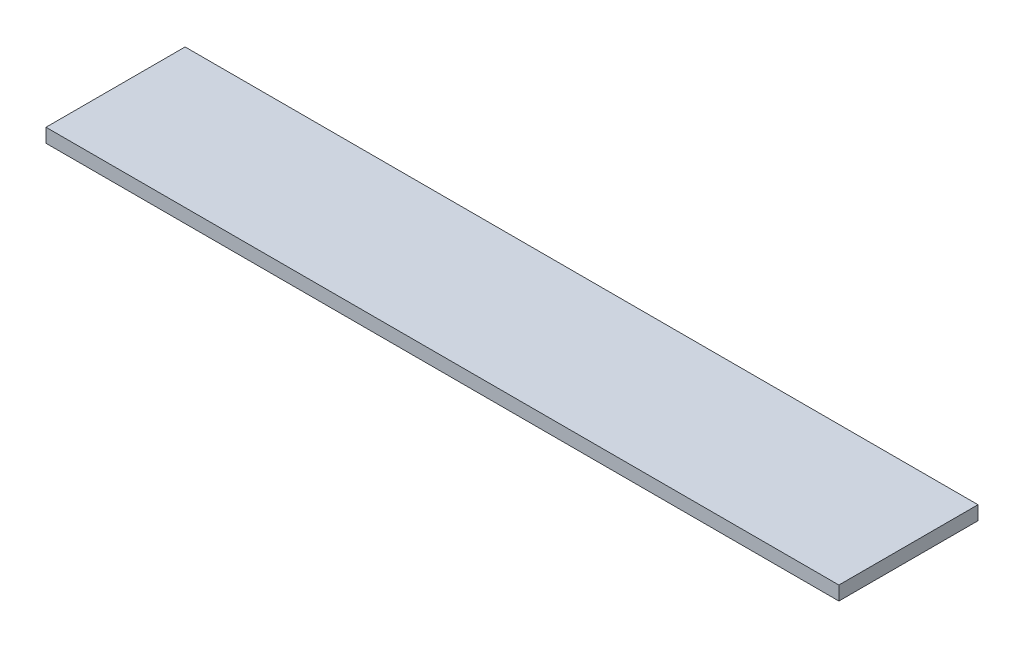
ISO-10303-21;
HEADER;
FILE_DESCRIPTION(('STEP AP214'),'2;1');
FILE_NAME('part.step','',(''),(''),'','','');
FILE_SCHEMA(('AUTOMOTIVE_DESIGN { 1 0 10303 214 1 1 1 1 }'));
ENDSEC;
DATA;
#1=APPLICATION_CONTEXT('core data for automotive mechanical design processes');
#2=APPLICATION_PROTOCOL_DEFINITION('international standard','automotive_design',2000,#1);
#3=PRODUCT_CONTEXT('',#1,'mechanical');
#4=PRODUCT('Part','Part','',(#3));
#5=PRODUCT_RELATED_PRODUCT_CATEGORY('part','',(#4));
#6=PRODUCT_DEFINITION_FORMATION('','',#4);
#7=PRODUCT_DEFINITION_CONTEXT('part definition',#1,'design');
#8=PRODUCT_DEFINITION('design','',#6,#7);
#9=PRODUCT_DEFINITION_SHAPE('','',#8);
#10=(LENGTH_UNIT() NAMED_UNIT(*) SI_UNIT(.MILLI.,.METRE.));
#11=(NAMED_UNIT(*) PLANE_ANGLE_UNIT() SI_UNIT($,.RADIAN.));
#12=(NAMED_UNIT(*) SI_UNIT($,.STERADIAN.) SOLID_ANGLE_UNIT());
#13=UNCERTAINTY_MEASURE_WITH_UNIT(LENGTH_MEASURE(1.E-05),#10,'distance_accuracy_value','');
#14=(GEOMETRIC_REPRESENTATION_CONTEXT(3) GLOBAL_UNCERTAINTY_ASSIGNED_CONTEXT((#13)) GLOBAL_UNIT_ASSIGNED_CONTEXT((#10,
#11,#12)) REPRESENTATION_CONTEXT('',''));
#15=CARTESIAN_POINT('',(0.,0.,0.));
#16=DIRECTION('',(0.,0.,1.));
#17=DIRECTION('',(1.,0.,0.));
#18=AXIS2_PLACEMENT_3D('',#15,#16,#17);
#19=CARTESIAN_POINT('',(-44.3111111111111,14.3555555555555,5.25));
#20=DIRECTION('',(1.,0.,0.));
#21=DIRECTION('',(0.,1.,0.));
#22=AXIS2_PLACEMENT_3D('',#19,#20,#21);
#23=PLANE('',#22);
#24=DIRECTION('',(0.,0.,-1.));
#25=VECTOR('',#24,1.);
#26=CARTESIAN_POINT('',(-44.3111111111111,15.3555555555555,5.25));
#27=LINE('',#26,#25);
#28=CARTESIAN_POINT('',(-44.3111111111111,15.3555555555555,5.25));
#29=VERTEX_POINT('',#28);
#30=CARTESIAN_POINT('',(-44.3111111111111,15.3555555555556,-4.75));
#31=VERTEX_POINT('',#30);
#32=EDGE_CURVE('E98',#29,#31,#27,.T.);
#33=ORIENTED_EDGE('',*,*,#32,.T.);
#34=DIRECTION('',(0.,1.,0.));
#35=VECTOR('',#34,1.);
#36=CARTESIAN_POINT('',(-44.3111111111111,14.3555555555556,-4.75));
#37=LINE('',#36,#35);
#38=CARTESIAN_POINT('',(-44.3111111111111,14.3555555555556,-4.75));
#39=VERTEX_POINT('',#38);
#40=EDGE_CURVE('E11',#39,#31,#37,.T.);
#41=ORIENTED_EDGE('',*,*,#40,.F.);
#42=DIRECTION('',(0.,0.,-1.));
#43=VECTOR('',#42,1.);
#44=CARTESIAN_POINT('',(-44.3111111111111,14.3555555555555,5.25));
#45=LINE('',#44,#43);
#46=CARTESIAN_POINT('',(-44.3111111111111,14.3555555555555,5.25));
#47=VERTEX_POINT('',#46);
#48=EDGE_CURVE('E86',#47,#39,#45,.T.);
#49=ORIENTED_EDGE('',*,*,#48,.F.);
#50=DIRECTION('',(0.,1.,0.));
#51=VECTOR('',#50,1.);
#52=CARTESIAN_POINT('',(-44.3111111111111,14.3555555555555,5.25));
#53=LINE('',#52,#51);
#54=EDGE_CURVE('E94',#47,#29,#53,.T.);
#55=ORIENTED_EDGE('',*,*,#54,.T.);
#56=EDGE_LOOP('',(#33,#41,#49,#55));
#57=FACE_BOUND('',#56,.T.);
#58=ADVANCED_FACE('F35',(#57),#23,.F.);
#59=CARTESIAN_POINT('',(-44.3111111111111,14.3555555555556,-4.75));
#60=DIRECTION('',(0.,0.,1.));
#61=DIRECTION('',(0.,-1.,0.));
#62=AXIS2_PLACEMENT_3D('',#59,#60,#61);
#63=PLANE('',#62);
#64=DIRECTION('',(1.,0.,0.));
#65=VECTOR('',#64,1.);
#66=CARTESIAN_POINT('',(-44.3111111111111,15.3555555555556,-4.75));
#67=LINE('',#66,#65);
#68=CARTESIAN_POINT('',(12.6888888888889,15.3555555555556,-4.75));
#69=VERTEX_POINT('',#68);
#70=EDGE_CURVE('E90',#31,#69,#67,.T.);
#71=ORIENTED_EDGE('',*,*,#70,.T.);
#72=DIRECTION('',(0.,1.,0.));
#73=VECTOR('',#72,1.);
#74=CARTESIAN_POINT('',(12.6888888888889,14.3555555555556,-4.75));
#75=LINE('',#74,#73);
#76=CARTESIAN_POINT('',(12.6888888888889,14.3555555555556,-4.75));
#77=VERTEX_POINT('',#76);
#78=EDGE_CURVE('E43',#77,#69,#75,.T.);
#79=ORIENTED_EDGE('',*,*,#78,.F.);
#80=DIRECTION('',(1.,0.,0.));
#81=VECTOR('',#80,1.);
#82=CARTESIAN_POINT('',(-44.3111111111111,14.3555555555556,-4.75));
#83=LINE('',#82,#81);
#84=EDGE_CURVE('E81',#39,#77,#83,.T.);
#85=ORIENTED_EDGE('',*,*,#84,.F.);
#86=ORIENTED_EDGE('',*,*,#40,.T.);
#87=EDGE_LOOP('',(#71,#79,#85,#86));
#88=FACE_BOUND('',#87,.T.);
#89=ADVANCED_FACE('F89',(#88),#63,.F.);
#90=CARTESIAN_POINT('',(12.6888888888889,14.3555555555555,5.25));
#91=DIRECTION('',(-1.,0.,0.));
#92=DIRECTION('',(0.,0.,-1.));
#93=AXIS2_PLACEMENT_3D('',#90,#91,#92);
#94=PLANE('',#93);
#95=DIRECTION('',(0.,0.,1.));
#96=VECTOR('',#95,1.);
#97=CARTESIAN_POINT('',(12.6888888888889,15.3555555555555,5.25));
#98=LINE('',#97,#96);
#99=CARTESIAN_POINT('',(12.6888888888889,15.3555555555555,5.25));
#100=VERTEX_POINT('',#99);
#101=EDGE_CURVE('E68',#69,#100,#98,.T.);
#102=ORIENTED_EDGE('',*,*,#101,.T.);
#103=DIRECTION('',(0.,1.,0.));
#104=VECTOR('',#103,1.);
#105=CARTESIAN_POINT('',(12.6888888888889,14.3555555555555,5.25));
#106=LINE('',#105,#104);
#107=CARTESIAN_POINT('',(12.6888888888889,14.3555555555555,5.25));
#108=VERTEX_POINT('',#107);
#109=EDGE_CURVE('E91',#108,#100,#106,.T.);
#110=ORIENTED_EDGE('',*,*,#109,.F.);
#111=DIRECTION('',(0.,0.,1.));
#112=VECTOR('',#111,1.);
#113=CARTESIAN_POINT('',(12.6888888888889,14.3555555555555,5.25));
#114=LINE('',#113,#112);
#115=EDGE_CURVE('E84',#77,#108,#114,.T.);
#116=ORIENTED_EDGE('',*,*,#115,.F.);
#117=ORIENTED_EDGE('',*,*,#78,.T.);
#118=EDGE_LOOP('',(#102,#110,#116,#117));
#119=FACE_BOUND('',#118,.T.);
#120=ADVANCED_FACE('F92',(#119),#94,.F.);
#121=CARTESIAN_POINT('',(-44.3111111111111,14.3555555555555,5.25));
#122=DIRECTION('',(0.,0.,-1.));
#123=DIRECTION('',(0.,1.,0.));
#124=AXIS2_PLACEMENT_3D('',#121,#122,#123);
#125=PLANE('',#124);
#126=DIRECTION('',(-1.,0.,0.));
#127=VECTOR('',#126,1.);
#128=CARTESIAN_POINT('',(-44.3111111111111,15.3555555555555,5.25));
#129=LINE('',#128,#127);
#130=EDGE_CURVE('E74',#100,#29,#129,.T.);
#131=ORIENTED_EDGE('',*,*,#130,.T.);
#132=ORIENTED_EDGE('',*,*,#54,.F.);
#133=DIRECTION('',(-1.,0.,0.));
#134=VECTOR('',#133,1.);
#135=CARTESIAN_POINT('',(-44.3111111111111,14.3555555555555,5.25));
#136=LINE('',#135,#134);
#137=EDGE_CURVE('E51',#108,#47,#136,.T.);
#138=ORIENTED_EDGE('',*,*,#137,.F.);
#139=ORIENTED_EDGE('',*,*,#109,.T.);
#140=EDGE_LOOP('',(#131,#132,#138,#139));
#141=FACE_BOUND('',#140,.T.);
#142=ADVANCED_FACE('F105',(#141),#125,.F.);
#143=CARTESIAN_POINT('',(0.,14.3555555555556,-14.8555555555556));
#144=DIRECTION('',(0.,-1.,0.));
#145=DIRECTION('',(1.,0.,0.));
#146=AXIS2_PLACEMENT_3D('',#143,#144,#145);
#147=PLANE('',#146);
#148=ORIENTED_EDGE('',*,*,#48,.T.);
#149=ORIENTED_EDGE('',*,*,#84,.T.);
#150=ORIENTED_EDGE('',*,*,#115,.T.);
#151=ORIENTED_EDGE('',*,*,#137,.T.);
#152=EDGE_LOOP('',(#148,#149,#150,#151));
#153=FACE_BOUND('',#152,.T.);
#154=ADVANCED_FACE('F82',(#153),#147,.T.);
#155=CARTESIAN_POINT('',(0.,15.3555555555556,-14.8555555555555));
#156=DIRECTION('',(0.,-1.,0.));
#157=DIRECTION('',(1.,0.,0.));
#158=AXIS2_PLACEMENT_3D('',#155,#156,#157);
#159=PLANE('',#158);
#160=ORIENTED_EDGE('',*,*,#32,.F.);
#161=ORIENTED_EDGE('',*,*,#130,.F.);
#162=ORIENTED_EDGE('',*,*,#101,.F.);
#163=ORIENTED_EDGE('',*,*,#70,.F.);
#164=EDGE_LOOP('',(#160,#161,#162,#163));
#165=FACE_BOUND('',#164,.T.);
#166=ADVANCED_FACE('F108',(#165),#159,.F.);
#167=CLOSED_SHELL('',(#58,#89,#120,#142,#154,#166));
#168=MANIFOLD_SOLID_BREP('B2',#167);
#169=ADVANCED_BREP_SHAPE_REPRESENTATION('',(#18,#168),#14);
#170=SHAPE_DEFINITION_REPRESENTATION(#9,#169);
ENDSEC;
END-ISO-10303-21;
